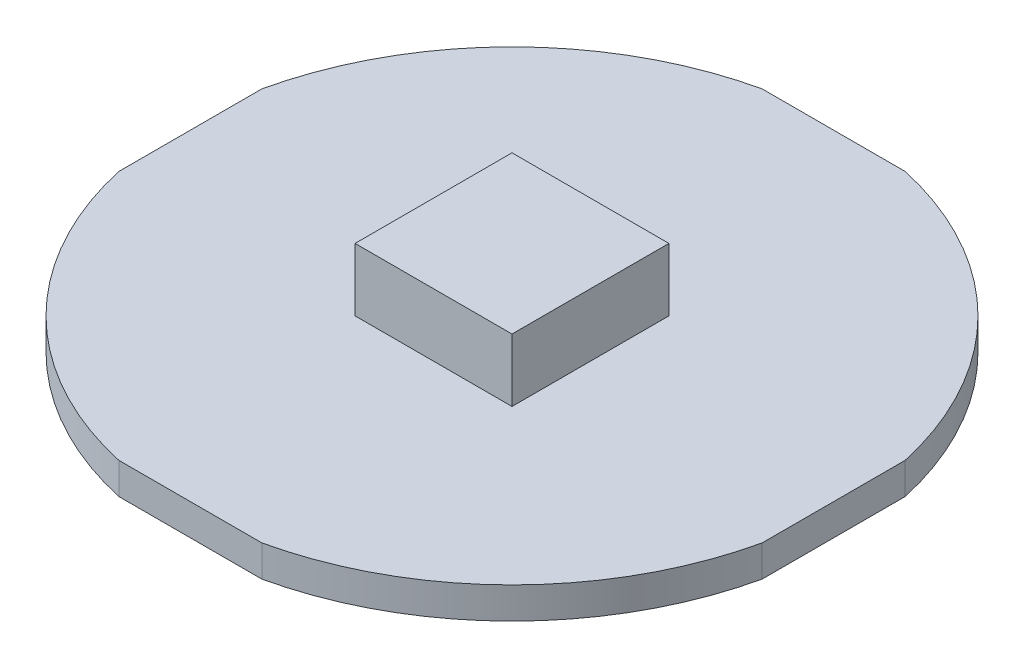
ISO-10303-21;
HEADER;
FILE_DESCRIPTION(('STEP AP214'),'2;1');
FILE_NAME('part.step','',(''),(''),'','','');
FILE_SCHEMA(('AUTOMOTIVE_DESIGN { 1 0 10303 214 1 1 1 1 }'));
ENDSEC;
DATA;
#1=APPLICATION_CONTEXT('core data for automotive mechanical design processes');
#2=APPLICATION_PROTOCOL_DEFINITION('international standard','automotive_design',2000,#1);
#3=PRODUCT_CONTEXT('',#1,'mechanical');
#4=PRODUCT('Part','Part','',(#3));
#5=PRODUCT_RELATED_PRODUCT_CATEGORY('part','',(#4));
#6=PRODUCT_DEFINITION_FORMATION('','',#4);
#7=PRODUCT_DEFINITION_CONTEXT('part definition',#1,'design');
#8=PRODUCT_DEFINITION('design','',#6,#7);
#9=PRODUCT_DEFINITION_SHAPE('','',#8);
#10=(LENGTH_UNIT() NAMED_UNIT(*) SI_UNIT(.MILLI.,.METRE.));
#11=(NAMED_UNIT(*) PLANE_ANGLE_UNIT() SI_UNIT($,.RADIAN.));
#12=(NAMED_UNIT(*) SI_UNIT($,.STERADIAN.) SOLID_ANGLE_UNIT());
#13=UNCERTAINTY_MEASURE_WITH_UNIT(LENGTH_MEASURE(1.E-05),#10,'distance_accuracy_value','');
#14=(GEOMETRIC_REPRESENTATION_CONTEXT(3) GLOBAL_UNCERTAINTY_ASSIGNED_CONTEXT((#13)) GLOBAL_UNIT_ASSIGNED_CONTEXT((#10,
#11,#12)) REPRESENTATION_CONTEXT('',''));
#15=CARTESIAN_POINT('',(0.,0.,0.));
#16=DIRECTION('',(0.,0.,1.));
#17=DIRECTION('',(1.,0.,0.));
#18=AXIS2_PLACEMENT_3D('',#15,#16,#17);
#19=CARTESIAN_POINT('',(3.96875,4.7625,3.96875));
#20=DIRECTION('',(-1.,0.,0.));
#21=DIRECTION('',(0.,0.,1.));
#22=AXIS2_PLACEMENT_3D('',#19,#20,#21);
#23=PLANE('',#22);
#24=DIRECTION('',(0.,0.,-1.));
#25=VECTOR('',#24,1.);
#26=CARTESIAN_POINT('',(3.96875,1.5875,3.96875));
#27=LINE('',#26,#25);
#28=CARTESIAN_POINT('',(3.96875,1.5875,3.96875));
#29=VERTEX_POINT('',#28);
#30=CARTESIAN_POINT('',(3.96875,1.5875,-3.96875));
#31=VERTEX_POINT('',#30);
#32=EDGE_CURVE('E105',#29,#31,#27,.T.);
#33=ORIENTED_EDGE('',*,*,#32,.T.);
#34=DIRECTION('',(0.,-1.,0.));
#35=VECTOR('',#34,1.);
#36=CARTESIAN_POINT('',(3.96875,4.7625,-3.96875));
#37=LINE('',#36,#35);
#38=CARTESIAN_POINT('',(3.96875,4.7625,-3.96875));
#39=VERTEX_POINT('',#38);
#40=EDGE_CURVE('E12',#39,#31,#37,.T.);
#41=ORIENTED_EDGE('',*,*,#40,.F.);
#42=DIRECTION('',(0.,0.,-1.));
#43=VECTOR('',#42,1.);
#44=CARTESIAN_POINT('',(3.96875,4.7625,3.96875));
#45=LINE('',#44,#43);
#46=CARTESIAN_POINT('',(3.96875,4.7625,3.96875));
#47=VERTEX_POINT('',#46);
#48=EDGE_CURVE('E93',#47,#39,#45,.T.);
#49=ORIENTED_EDGE('',*,*,#48,.F.);
#50=DIRECTION('',(0.,-1.,0.));
#51=VECTOR('',#50,1.);
#52=CARTESIAN_POINT('',(3.96875,4.7625,3.96875));
#53=LINE('',#52,#51);
#54=EDGE_CURVE('E101',#47,#29,#53,.T.);
#55=ORIENTED_EDGE('',*,*,#54,.T.);
#56=EDGE_LOOP('',(#33,#41,#49,#55));
#57=FACE_BOUND('',#56,.T.);
#58=ADVANCED_FACE('F42',(#57),#23,.F.);
#59=CARTESIAN_POINT('',(-3.96875,4.7625,-3.96875));
#60=DIRECTION('',(0.,0.,1.));
#61=DIRECTION('',(1.,0.,0.));
#62=AXIS2_PLACEMENT_3D('',#59,#60,#61);
#63=PLANE('',#62);
#64=DIRECTION('',(-1.,0.,0.));
#65=VECTOR('',#64,1.);
#66=CARTESIAN_POINT('',(-3.96875,1.5875,-3.96875));
#67=LINE('',#66,#65);
#68=CARTESIAN_POINT('',(-3.96875,1.5875,-3.96875));
#69=VERTEX_POINT('',#68);
#70=EDGE_CURVE('E97',#31,#69,#67,.T.);
#71=ORIENTED_EDGE('',*,*,#70,.T.);
#72=DIRECTION('',(0.,-1.,0.));
#73=VECTOR('',#72,1.);
#74=CARTESIAN_POINT('',(-3.96875,4.7625,-3.96875));
#75=LINE('',#74,#73);
#76=CARTESIAN_POINT('',(-3.96875,4.7625,-3.96875));
#77=VERTEX_POINT('',#76);
#78=EDGE_CURVE('E50',#77,#69,#75,.T.);
#79=ORIENTED_EDGE('',*,*,#78,.F.);
#80=DIRECTION('',(-1.,0.,0.));
#81=VECTOR('',#80,1.);
#82=CARTESIAN_POINT('',(-3.96875,4.7625,-3.96875));
#83=LINE('',#82,#81);
#84=EDGE_CURVE('E88',#39,#77,#83,.T.);
#85=ORIENTED_EDGE('',*,*,#84,.F.);
#86=ORIENTED_EDGE('',*,*,#40,.T.);
#87=EDGE_LOOP('',(#71,#79,#85,#86));
#88=FACE_BOUND('',#87,.T.);
#89=ADVANCED_FACE('F96',(#88),#63,.F.);
#90=CARTESIAN_POINT('',(-3.96875,4.7625,3.96875));
#91=DIRECTION('',(1.,0.,0.));
#92=DIRECTION('',(0.,0.,-1.));
#93=AXIS2_PLACEMENT_3D('',#90,#91,#92);
#94=PLANE('',#93);
#95=DIRECTION('',(0.,0.,1.));
#96=VECTOR('',#95,1.);
#97=CARTESIAN_POINT('',(-3.96875,1.5875,3.96875));
#98=LINE('',#97,#96);
#99=CARTESIAN_POINT('',(-3.96875,1.5875,3.96875));
#100=VERTEX_POINT('',#99);
#101=EDGE_CURVE('E75',#69,#100,#98,.T.);
#102=ORIENTED_EDGE('',*,*,#101,.T.);
#103=DIRECTION('',(0.,-1.,0.));
#104=VECTOR('',#103,1.);
#105=CARTESIAN_POINT('',(-3.96875,4.7625,3.96875));
#106=LINE('',#105,#104);
#107=CARTESIAN_POINT('',(-3.96875,4.7625,3.96875));
#108=VERTEX_POINT('',#107);
#109=EDGE_CURVE('E98',#108,#100,#106,.T.);
#110=ORIENTED_EDGE('',*,*,#109,.F.);
#111=DIRECTION('',(0.,0.,1.));
#112=VECTOR('',#111,1.);
#113=CARTESIAN_POINT('',(-3.96875,4.7625,3.96875));
#114=LINE('',#113,#112);
#115=EDGE_CURVE('E91',#77,#108,#114,.T.);
#116=ORIENTED_EDGE('',*,*,#115,.F.);
#117=ORIENTED_EDGE('',*,*,#78,.T.);
#118=EDGE_LOOP('',(#102,#110,#116,#117));
#119=FACE_BOUND('',#118,.T.);
#120=ADVANCED_FACE('F99',(#119),#94,.F.);
#121=CARTESIAN_POINT('',(-3.96875,4.7625,3.96875));
#122=DIRECTION('',(0.,0.,-1.));
#123=DIRECTION('',(-1.,0.,0.));
#124=AXIS2_PLACEMENT_3D('',#121,#122,#123);
#125=PLANE('',#124);
#126=DIRECTION('',(1.,0.,0.));
#127=VECTOR('',#126,1.);
#128=CARTESIAN_POINT('',(-3.96875,1.5875,3.96875));
#129=LINE('',#128,#127);
#130=EDGE_CURVE('E81',#100,#29,#129,.T.);
#131=ORIENTED_EDGE('',*,*,#130,.T.);
#132=ORIENTED_EDGE('',*,*,#54,.F.);
#133=DIRECTION('',(1.,0.,0.));
#134=VECTOR('',#133,1.);
#135=CARTESIAN_POINT('',(-3.96875,4.7625,3.96875));
#136=LINE('',#135,#134);
#137=EDGE_CURVE('E58',#108,#47,#136,.T.);
#138=ORIENTED_EDGE('',*,*,#137,.F.);
#139=ORIENTED_EDGE('',*,*,#109,.T.);
#140=EDGE_LOOP('',(#131,#132,#138,#139));
#141=FACE_BOUND('',#140,.T.);
#142=ADVANCED_FACE('F112',(#141),#125,.F.);
#143=CARTESIAN_POINT('',(3.96875,4.7625,-3.96875));
#144=DIRECTION('',(0.,-1.,0.));
#145=DIRECTION('',(0.,0.,-1.));
#146=AXIS2_PLACEMENT_3D('',#143,#144,#145);
#147=PLANE('',#146);
#148=ORIENTED_EDGE('',*,*,#48,.T.);
#149=ORIENTED_EDGE('',*,*,#84,.T.);
#150=ORIENTED_EDGE('',*,*,#115,.T.);
#151=ORIENTED_EDGE('',*,*,#137,.T.);
#152=EDGE_LOOP('',(#148,#149,#150,#151));
#153=FACE_BOUND('',#152,.T.);
#154=ADVANCED_FACE('F89',(#153),#147,.F.);
#155=CARTESIAN_POINT('',(3.96875,1.5875,-3.96875));
#156=DIRECTION('',(0.,-1.,0.));
#157=DIRECTION('',(0.,0.,-1.));
#158=AXIS2_PLACEMENT_3D('',#155,#156,#157);
#159=PLANE('',#158);
#160=ORIENTED_EDGE('',*,*,#32,.F.);
#161=ORIENTED_EDGE('',*,*,#130,.F.);
#162=ORIENTED_EDGE('',*,*,#101,.F.);
#163=ORIENTED_EDGE('',*,*,#70,.F.);
#164=EDGE_LOOP('',(#160,#161,#162,#163));
#165=FACE_BOUND('',#164,.T.);
#166=ADVANCED_FACE('F115',(#165),#159,.T.);
#167=CLOSED_SHELL('',(#58,#89,#120,#142,#154,#166));
#168=MANIFOLD_SOLID_BREP('B2',#167);
#169=CARTESIAN_POINT('',(0.,1.5875,0.));
#170=DIRECTION('',(0.,-1.,0.));
#171=DIRECTION('',(0.,0.,-1.));
#172=AXIS2_PLACEMENT_3D('',#169,#170,#171);
#173=CYLINDRICAL_SURFACE('',#172,16.66875);
#174=CARTESIAN_POINT('',(0.,1.5875,0.));
#175=DIRECTION('',(0.,1.,0.));
#176=DIRECTION('',(0.,0.,1.));
#177=AXIS2_PLACEMENT_3D('',#174,#175,#176);
#178=CIRCLE('',#177,16.66875);
#179=CARTESIAN_POINT('',(3.61570332672295,1.5875,16.271875));
#180=VERTEX_POINT('',#179);
#181=CARTESIAN_POINT('',(16.271875,1.5875,3.61570332672289));
#182=VERTEX_POINT('',#181);
#183=EDGE_CURVE('E174',#180,#182,#178,.T.);
#184=ORIENTED_EDGE('',*,*,#183,.F.);
#185=DIRECTION('',(0.,1.,0.));
#186=VECTOR('',#185,1.);
#187=CARTESIAN_POINT('',(3.61570332672295,-0.000999999999999916,16.271875));
#188=LINE('',#187,#186);
#189=CARTESIAN_POINT('',(3.61570332672293,0.,16.271875));
#190=VERTEX_POINT('',#189);
#191=EDGE_CURVE('E232',#190,#180,#188,.T.);
#192=ORIENTED_EDGE('',*,*,#191,.F.);
#193=CARTESIAN_POINT('',(0.,0.,0.));
#194=DIRECTION('',(0.,1.,0.));
#195=DIRECTION('',(0.,0.,1.));
#196=AXIS2_PLACEMENT_3D('',#193,#194,#195);
#197=CIRCLE('',#196,16.66875);
#198=CARTESIAN_POINT('',(16.271875,0.,3.61570332672289));
#199=VERTEX_POINT('',#198);
#200=EDGE_CURVE('E243',#190,#199,#197,.T.);
#201=ORIENTED_EDGE('',*,*,#200,.T.);
#202=DIRECTION('',(0.,1.,0.));
#203=VECTOR('',#202,1.);
#204=CARTESIAN_POINT('',(16.271875,-0.000999999999999916,3.61570332672289));
#205=LINE('',#204,#203);
#206=EDGE_CURVE('E274',#199,#182,#205,.T.);
#207=ORIENTED_EDGE('',*,*,#206,.T.);
#208=EDGE_LOOP('',(#184,#192,#201,#207));
#209=FACE_BOUND('',#208,.T.);
#210=ADVANCED_FACE('F165',(#209),#173,.T.);
#211=CARTESIAN_POINT('',(-3.61570332672295,1.5875,-16.271875));
#212=VERTEX_POINT('',#211);
#213=CARTESIAN_POINT('',(-16.271875,1.5875,-3.61570332672289));
#214=VERTEX_POINT('',#213);
#215=EDGE_CURVE('E253',#212,#214,#178,.T.);
#216=ORIENTED_EDGE('',*,*,#215,.F.);
#217=DIRECTION('',(0.,1.,0.));
#218=VECTOR('',#217,1.);
#219=CARTESIAN_POINT('',(-3.61570332672295,-0.000999999999999916,-16.271875));
#220=LINE('',#219,#218);
#221=CARTESIAN_POINT('',(-3.61570332672293,0.,-16.271875));
#222=VERTEX_POINT('',#221);
#223=EDGE_CURVE('E283',#222,#212,#220,.T.);
#224=ORIENTED_EDGE('',*,*,#223,.F.);
#225=CARTESIAN_POINT('',(-16.271875,0.,-3.61570332672289));
#226=VERTEX_POINT('',#225);
#227=EDGE_CURVE('E252',#222,#226,#197,.T.);
#228=ORIENTED_EDGE('',*,*,#227,.T.);
#229=DIRECTION('',(0.,1.,0.));
#230=VECTOR('',#229,1.);
#231=CARTESIAN_POINT('',(-16.271875,-0.000999999999999916,-3.61570332672289));
#232=LINE('',#231,#230);
#233=EDGE_CURVE('E261',#226,#214,#232,.T.);
#234=ORIENTED_EDGE('',*,*,#233,.T.);
#235=EDGE_LOOP('',(#216,#224,#228,#234));
#236=FACE_BOUND('',#235,.T.);
#237=ADVANCED_FACE('F296',(#236),#173,.T.);
#238=CARTESIAN_POINT('',(16.271875,0.,-3.61570332672289));
#239=VERTEX_POINT('',#238);
#240=CARTESIAN_POINT('',(3.61570332672282,0.,-16.271875));
#241=VERTEX_POINT('',#240);
#242=EDGE_CURVE('E251',#239,#241,#197,.T.);
#243=ORIENTED_EDGE('',*,*,#242,.T.);
#244=DIRECTION('',(0.,1.,0.));
#245=VECTOR('',#244,1.);
#246=CARTESIAN_POINT('',(3.61570332672282,-0.000999999999999916,-16.271875));
#247=LINE('',#246,#245);
#248=CARTESIAN_POINT('',(3.61570332672282,1.5875,-16.271875));
#249=VERTEX_POINT('',#248);
#250=EDGE_CURVE('E190',#241,#249,#247,.T.);
#251=ORIENTED_EDGE('',*,*,#250,.T.);
#252=CARTESIAN_POINT('',(16.271875,1.5875,-3.61570332672289));
#253=VERTEX_POINT('',#252);
#254=EDGE_CURVE('E175',#253,#249,#178,.T.);
#255=ORIENTED_EDGE('',*,*,#254,.F.);
#256=DIRECTION('',(0.,1.,0.));
#257=VECTOR('',#256,1.);
#258=CARTESIAN_POINT('',(16.271875,-0.000999999999999916,-3.61570332672289));
#259=LINE('',#258,#257);
#260=EDGE_CURVE('E275',#239,#253,#259,.T.);
#261=ORIENTED_EDGE('',*,*,#260,.F.);
#262=EDGE_LOOP('',(#243,#251,#255,#261));
#263=FACE_BOUND('',#262,.T.);
#264=ADVANCED_FACE('F304',(#263),#173,.T.);
#265=CARTESIAN_POINT('',(-16.271875,0.,3.61570332672289));
#266=VERTEX_POINT('',#265);
#267=CARTESIAN_POINT('',(-3.61570332672282,0.,16.271875));
#268=VERTEX_POINT('',#267);
#269=EDGE_CURVE('E169',#266,#268,#197,.T.);
#270=ORIENTED_EDGE('',*,*,#269,.T.);
#271=DIRECTION('',(0.,1.,0.));
#272=VECTOR('',#271,1.);
#273=CARTESIAN_POINT('',(-3.61570332672282,-0.000999999999999916,16.271875));
#274=LINE('',#273,#272);
#275=CARTESIAN_POINT('',(-3.61570332672282,1.5875,16.271875));
#276=VERTEX_POINT('',#275);
#277=EDGE_CURVE('E182',#268,#276,#274,.T.);
#278=ORIENTED_EDGE('',*,*,#277,.T.);
#279=CARTESIAN_POINT('',(-16.271875,1.5875,3.61570332672289));
#280=VERTEX_POINT('',#279);
#281=EDGE_CURVE('E40',#280,#276,#178,.T.);
#282=ORIENTED_EDGE('',*,*,#281,.F.);
#283=DIRECTION('',(0.,1.,0.));
#284=VECTOR('',#283,1.);
#285=CARTESIAN_POINT('',(-16.271875,-0.000999999999999916,3.61570332672289));
#286=LINE('',#285,#284);
#287=EDGE_CURVE('E266',#266,#280,#286,.T.);
#288=ORIENTED_EDGE('',*,*,#287,.F.);
#289=EDGE_LOOP('',(#270,#278,#282,#288));
#290=FACE_BOUND('',#289,.T.);
#291=ADVANCED_FACE('F167',(#290),#173,.T.);
#292=CARTESIAN_POINT('',(0.,1.5875,0.));
#293=DIRECTION('',(0.,1.,0.));
#294=DIRECTION('',(0.,0.,1.));
#295=AXIS2_PLACEMENT_3D('',#292,#293,#294);
#296=PLANE('',#295);
#297=DIRECTION('',(-1.,0.,0.));
#298=VECTOR('',#297,1.);
#299=CARTESIAN_POINT('',(3.61570332672295,1.5875,16.271875));
#300=LINE('',#299,#298);
#301=EDGE_CURVE('E245',#180,#276,#300,.T.);
#302=ORIENTED_EDGE('',*,*,#301,.F.);
#303=ORIENTED_EDGE('',*,*,#183,.T.);
#304=DIRECTION('',(0.,0.,1.));
#305=VECTOR('',#304,1.);
#306=CARTESIAN_POINT('',(16.271875,1.5875,-3.61570332672289));
#307=LINE('',#306,#305);
#308=EDGE_CURVE('E277',#253,#182,#307,.T.);
#309=ORIENTED_EDGE('',*,*,#308,.F.);
#310=ORIENTED_EDGE('',*,*,#254,.T.);
#311=DIRECTION('',(1.,0.,0.));
#312=VECTOR('',#311,1.);
#313=CARTESIAN_POINT('',(3.61570332672282,1.5875,-16.271875));
#314=LINE('',#313,#312);
#315=EDGE_CURVE('E238',#212,#249,#314,.T.);
#316=ORIENTED_EDGE('',*,*,#315,.F.);
#317=ORIENTED_EDGE('',*,*,#215,.T.);
#318=DIRECTION('',(0.,0.,-1.));
#319=VECTOR('',#318,1.);
#320=CARTESIAN_POINT('',(-16.271875,1.5875,-3.61570332672289));
#321=LINE('',#320,#319);
#322=EDGE_CURVE('E269',#280,#214,#321,.T.);
#323=ORIENTED_EDGE('',*,*,#322,.F.);
#324=ORIENTED_EDGE('',*,*,#281,.T.);
#325=EDGE_LOOP('',(#302,#303,#309,#310,#316,#317,#323,#324));
#326=FACE_BOUND('',#325,.T.);
#327=ADVANCED_FACE('F292',(#326),#296,.T.);
#328=CARTESIAN_POINT('',(0.,0.,0.));
#329=DIRECTION('',(0.,1.,0.));
#330=DIRECTION('',(0.,0.,1.));
#331=AXIS2_PLACEMENT_3D('',#328,#329,#330);
#332=PLANE('',#331);
#333=ORIENTED_EDGE('',*,*,#200,.F.);
#334=DIRECTION('',(1.,0.,0.));
#335=VECTOR('',#334,1.);
#336=CARTESIAN_POINT('',(3.61570332672295,0.,16.271875));
#337=LINE('',#336,#335);
#338=EDGE_CURVE('E229',#268,#190,#337,.T.);
#339=ORIENTED_EDGE('',*,*,#338,.F.);
#340=ORIENTED_EDGE('',*,*,#269,.F.);
#341=DIRECTION('',(0.,0.,1.));
#342=VECTOR('',#341,1.);
#343=CARTESIAN_POINT('',(-16.271875,0.,-3.61570332672289));
#344=LINE('',#343,#342);
#345=EDGE_CURVE('E255',#226,#266,#344,.T.);
#346=ORIENTED_EDGE('',*,*,#345,.F.);
#347=ORIENTED_EDGE('',*,*,#227,.F.);
#348=DIRECTION('',(-1.,0.,0.));
#349=VECTOR('',#348,1.);
#350=CARTESIAN_POINT('',(3.61570332672282,0.,-16.271875));
#351=LINE('',#350,#349);
#352=EDGE_CURVE('E281',#241,#222,#351,.T.);
#353=ORIENTED_EDGE('',*,*,#352,.F.);
#354=ORIENTED_EDGE('',*,*,#242,.F.);
#355=DIRECTION('',(0.,0.,-1.));
#356=VECTOR('',#355,1.);
#357=CARTESIAN_POINT('',(16.271875,0.,-3.61570332672289));
#358=LINE('',#357,#356);
#359=EDGE_CURVE('E250',#199,#239,#358,.T.);
#360=ORIENTED_EDGE('',*,*,#359,.F.);
#361=EDGE_LOOP('',(#333,#339,#340,#346,#347,#353,#354,#360));
#362=FACE_BOUND('',#361,.T.);
#363=ADVANCED_FACE('F248',(#362),#332,.F.);
#364=CARTESIAN_POINT('',(-16.271875,-0.000999999999999916,-3.61570332672289));
#365=DIRECTION('',(1.,0.,0.));
#366=DIRECTION('',(0.,0.,-1.));
#367=AXIS2_PLACEMENT_3D('',#364,#365,#366);
#368=PLANE('',#367);
#369=ORIENTED_EDGE('',*,*,#345,.T.);
#370=ORIENTED_EDGE('',*,*,#287,.T.);
#371=ORIENTED_EDGE('',*,*,#322,.T.);
#372=ORIENTED_EDGE('',*,*,#233,.F.);
#373=EDGE_LOOP('',(#369,#370,#371,#372));
#374=FACE_BOUND('',#373,.T.);
#375=ADVANCED_FACE('F295',(#374),#368,.F.);
#376=CARTESIAN_POINT('',(16.271875,-0.000999999999999916,-3.61570332672289));
#377=DIRECTION('',(-1.,0.,0.));
#378=DIRECTION('',(0.,0.,1.));
#379=AXIS2_PLACEMENT_3D('',#376,#377,#378);
#380=PLANE('',#379);
#381=ORIENTED_EDGE('',*,*,#359,.T.);
#382=ORIENTED_EDGE('',*,*,#260,.T.);
#383=ORIENTED_EDGE('',*,*,#308,.T.);
#384=ORIENTED_EDGE('',*,*,#206,.F.);
#385=EDGE_LOOP('',(#381,#382,#383,#384));
#386=FACE_BOUND('',#385,.T.);
#387=ADVANCED_FACE('F301',(#386),#380,.F.);
#388=CARTESIAN_POINT('',(3.61570332672282,-0.000999999999999916,-16.271875));
#389=DIRECTION('',(0.,0.,1.));
#390=DIRECTION('',(1.,0.,0.));
#391=AXIS2_PLACEMENT_3D('',#388,#389,#390);
#392=PLANE('',#391);
#393=ORIENTED_EDGE('',*,*,#352,.T.);
#394=ORIENTED_EDGE('',*,*,#223,.T.);
#395=ORIENTED_EDGE('',*,*,#315,.T.);
#396=ORIENTED_EDGE('',*,*,#250,.F.);
#397=EDGE_LOOP('',(#393,#394,#395,#396));
#398=FACE_BOUND('',#397,.T.);
#399=ADVANCED_FACE('F305',(#398),#392,.F.);
#400=CARTESIAN_POINT('',(3.61570332672295,-0.000999999999999916,16.271875));
#401=DIRECTION('',(0.,0.,-1.));
#402=DIRECTION('',(-1.,0.,0.));
#403=AXIS2_PLACEMENT_3D('',#400,#401,#402);
#404=PLANE('',#403);
#405=ORIENTED_EDGE('',*,*,#338,.T.);
#406=ORIENTED_EDGE('',*,*,#191,.T.);
#407=ORIENTED_EDGE('',*,*,#301,.T.);
#408=ORIENTED_EDGE('',*,*,#277,.F.);
#409=EDGE_LOOP('',(#405,#406,#407,#408));
#410=FACE_BOUND('',#409,.T.);
#411=ADVANCED_FACE('F231',(#410),#404,.F.);
#412=CLOSED_SHELL('',(#210,#237,#264,#291,#327,#363,#375,#387,#399,#411));
#413=MANIFOLD_SOLID_BREP('B6',#412);
#414=ADVANCED_BREP_SHAPE_REPRESENTATION('',(#18,#168,#413),#14);
#415=SHAPE_DEFINITION_REPRESENTATION(#9,#414);
ENDSEC;
END-ISO-10303-21;
